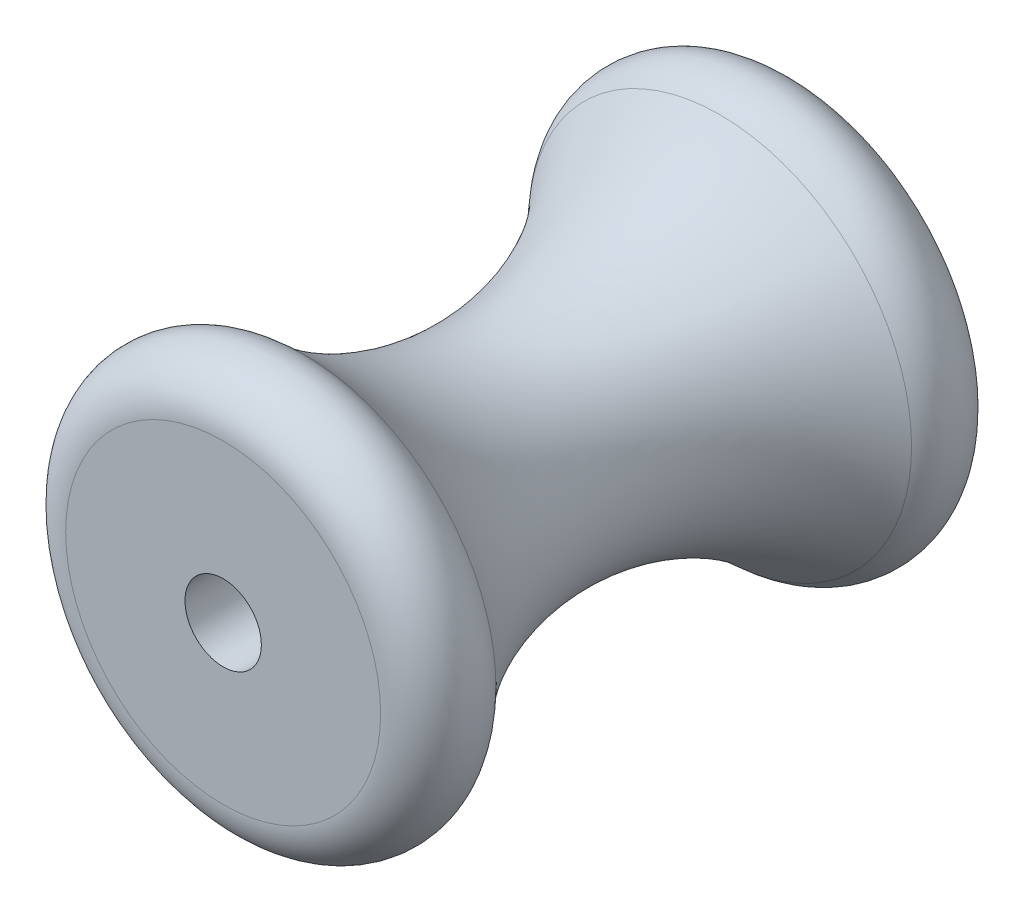
ISO-10303-21;
HEADER;
FILE_DESCRIPTION(('STEP AP214'),'2;1');
FILE_NAME('part.step','',(''),(''),'','','');
FILE_SCHEMA(('AUTOMOTIVE_DESIGN { 1 0 10303 214 1 1 1 1 }'));
ENDSEC;
DATA;
#1=APPLICATION_CONTEXT('core data for automotive mechanical design processes');
#2=APPLICATION_PROTOCOL_DEFINITION('international standard','automotive_design',2000,#1);
#3=PRODUCT_CONTEXT('',#1,'mechanical');
#4=PRODUCT('Part','Part','',(#3));
#5=PRODUCT_RELATED_PRODUCT_CATEGORY('part','',(#4));
#6=PRODUCT_DEFINITION_FORMATION('','',#4);
#7=PRODUCT_DEFINITION_CONTEXT('part definition',#1,'design');
#8=PRODUCT_DEFINITION('design','',#6,#7);
#9=PRODUCT_DEFINITION_SHAPE('','',#8);
#10=(LENGTH_UNIT() NAMED_UNIT(*) SI_UNIT(.MILLI.,.METRE.));
#11=(NAMED_UNIT(*) PLANE_ANGLE_UNIT() SI_UNIT($,.RADIAN.));
#12=(NAMED_UNIT(*) SI_UNIT($,.STERADIAN.) SOLID_ANGLE_UNIT());
#13=UNCERTAINTY_MEASURE_WITH_UNIT(LENGTH_MEASURE(1.E-05),#10,'distance_accuracy_value','');
#14=(GEOMETRIC_REPRESENTATION_CONTEXT(3) GLOBAL_UNCERTAINTY_ASSIGNED_CONTEXT((#13)) GLOBAL_UNIT_ASSIGNED_CONTEXT((#10,
#11,#12)) REPRESENTATION_CONTEXT('',''));
#15=CARTESIAN_POINT('',(0.,0.,0.));
#16=DIRECTION('',(0.,0.,1.));
#17=DIRECTION('',(1.,0.,0.));
#18=AXIS2_PLACEMENT_3D('',#15,#16,#17);
#19=CARTESIAN_POINT('',(0.,0.,-12.1));
#20=DIRECTION('',(0.,0.,-1.));
#21=DIRECTION('',(0.,1.,0.));
#22=AXIS2_PLACEMENT_3D('',#19,#20,#21);
#23=PLANE('',#22);
#24=CARTESIAN_POINT('',(0.,0.,-12.1));
#25=DIRECTION('',(0.,0.,-1.));
#26=DIRECTION('',(0.,1.,0.));
#27=AXIS2_PLACEMENT_3D('',#24,#25,#26);
#28=CIRCLE('',#27,6.59615455708805);
#29=CARTESIAN_POINT('',(0.,6.59615455708805,-12.1));
#30=VERTEX_POINT('',#29);
#31=EDGE_CURVE('E10',#30,#30,#28,.T.);
#32=ORIENTED_EDGE('',*,*,#31,.T.);
#33=EDGE_LOOP('',(#32));
#34=FACE_BOUND('',#33,.T.);
#35=CARTESIAN_POINT('',(0.,0.,-12.1));
#36=DIRECTION('',(0.,0.,-1.));
#37=DIRECTION('',(0.,1.,0.));
#38=AXIS2_PLACEMENT_3D('',#35,#36,#37);
#39=CIRCLE('',#38,1.60000000000001);
#40=CARTESIAN_POINT('',(0.,1.60000000000001,-12.1));
#41=VERTEX_POINT('',#40);
#42=EDGE_CURVE('E64',#41,#41,#39,.T.);
#43=ORIENTED_EDGE('',*,*,#42,.F.);
#44=EDGE_LOOP('',(#43));
#45=FACE_BOUND('',#44,.T.);
#46=ADVANCED_FACE('F41',(#34,#45),#23,.T.);
#47=CARTESIAN_POINT('',(0.,0.,0.));
#48=DIRECTION('',(0.,0.,-1.));
#49=DIRECTION('',(0.,1.,0.));
#50=AXIS2_PLACEMENT_3D('',#47,#48,#49);
#51=TOROIDAL_SURFACE('',#50,17.,12.5);
#52=CARTESIAN_POINT('',(0.,0.,8.70689655172414));
#53=DIRECTION('',(0.,0.,-1.));
#54=DIRECTION('',(0.,1.,0.));
#55=AXIS2_PLACEMENT_3D('',#52,#53,#54);
#56=CIRCLE('',#55,8.03116772162763);
#57=CARTESIAN_POINT('',(0.,8.03116772162763,8.70689655172414));
#58=VERTEX_POINT('',#57);
#59=EDGE_CURVE('E52',#58,#58,#56,.T.);
#60=ORIENTED_EDGE('',*,*,#59,.T.);
#61=EDGE_LOOP('',(#60));
#62=FACE_BOUND('',#61,.T.);
#63=CARTESIAN_POINT('',(0.,0.,-8.70689655172414));
#64=DIRECTION('',(0.,0.,1.));
#65=DIRECTION('',(0.,-1.,0.));
#66=AXIS2_PLACEMENT_3D('',#63,#64,#65);
#67=CIRCLE('',#66,8.03116772162763);
#68=CARTESIAN_POINT('',(0.,-8.03116772162763,-8.70689655172415));
#69=VERTEX_POINT('',#68);
#70=EDGE_CURVE('E56',#69,#69,#67,.T.);
#71=ORIENTED_EDGE('',*,*,#70,.T.);
#72=EDGE_LOOP('',(#71));
#73=FACE_BOUND('',#72,.T.);
#74=ADVANCED_FACE('F71',(#62,#73),#51,.F.);
#75=CARTESIAN_POINT('',(0.,0.,12.1));
#76=DIRECTION('',(0.,0.,-1.));
#77=DIRECTION('',(0.,1.,0.));
#78=AXIS2_PLACEMENT_3D('',#75,#76,#77);
#79=PLANE('',#78);
#80=CARTESIAN_POINT('',(0.,0.,12.1));
#81=DIRECTION('',(0.,0.,-1.));
#82=DIRECTION('',(0.,1.,0.));
#83=AXIS2_PLACEMENT_3D('',#80,#81,#82);
#84=CIRCLE('',#83,6.59615455708805);
#85=CARTESIAN_POINT('',(0.,6.59615455708805,12.1));
#86=VERTEX_POINT('',#85);
#87=EDGE_CURVE('E48',#86,#86,#84,.F.);
#88=ORIENTED_EDGE('',*,*,#87,.T.);
#89=EDGE_LOOP('',(#88));
#90=FACE_BOUND('',#89,.T.);
#91=CARTESIAN_POINT('',(0.,0.,12.1));
#92=DIRECTION('',(0.,0.,-1.));
#93=DIRECTION('',(0.,1.,0.));
#94=AXIS2_PLACEMENT_3D('',#91,#92,#93);
#95=CIRCLE('',#94,1.60000000000001);
#96=CARTESIAN_POINT('',(0.,1.6,12.1));
#97=VERTEX_POINT('',#96);
#98=EDGE_CURVE('E61',#97,#97,#95,.T.);
#99=ORIENTED_EDGE('',*,*,#98,.T.);
#100=EDGE_LOOP('',(#99));
#101=FACE_BOUND('',#100,.T.);
#102=ADVANCED_FACE('F77',(#90,#101),#79,.F.);
#103=CARTESIAN_POINT('',(0.,0.,-12.5));
#104=DIRECTION('',(0.,0.,-1.));
#105=DIRECTION('',(0.,1.,0.));
#106=AXIS2_PLACEMENT_3D('',#103,#104,#105);
#107=CYLINDRICAL_SURFACE('',#106,1.60000000000001);
#108=ORIENTED_EDGE('',*,*,#98,.F.);
#109=EDGE_LOOP('',(#108));
#110=FACE_BOUND('',#109,.T.);
#111=ORIENTED_EDGE('',*,*,#42,.T.);
#112=EDGE_LOOP('',(#111));
#113=FACE_BOUND('',#112,.T.);
#114=ADVANCED_FACE('F68',(#110,#113),#107,.F.);
#115=CARTESIAN_POINT('',(0.,0.,10.1));
#116=DIRECTION('',(0.,0.,1.));
#117=DIRECTION('',(0.,-1.,0.));
#118=AXIS2_PLACEMENT_3D('',#115,#116,#117);
#119=TOROIDAL_SURFACE('',#118,6.59615455708805,2.);
#120=ORIENTED_EDGE('',*,*,#87,.F.);
#121=EDGE_LOOP('',(#120));
#122=FACE_BOUND('',#121,.T.);
#123=ORIENTED_EDGE('',*,*,#59,.F.);
#124=EDGE_LOOP('',(#123));
#125=FACE_BOUND('',#124,.T.);
#126=ADVANCED_FACE('F81',(#122,#125),#119,.T.);
#127=CARTESIAN_POINT('',(0.,0.,-10.1));
#128=DIRECTION('',(0.,0.,1.));
#129=DIRECTION('',(0.,-1.,0.));
#130=AXIS2_PLACEMENT_3D('',#127,#128,#129);
#131=TOROIDAL_SURFACE('',#130,6.59615455708805,2.);
#132=ORIENTED_EDGE('',*,*,#70,.F.);
#133=EDGE_LOOP('',(#132));
#134=FACE_BOUND('',#133,.T.);
#135=ORIENTED_EDGE('',*,*,#31,.F.);
#136=EDGE_LOOP('',(#135));
#137=FACE_BOUND('',#136,.T.);
#138=ADVANCED_FACE('F43',(#134,#137),#131,.T.);
#139=CLOSED_SHELL('',(#46,#74,#102,#114,#126,#138));
#140=MANIFOLD_SOLID_BREP('B2',#139);
#141=ADVANCED_BREP_SHAPE_REPRESENTATION('',(#18,#140),#14);
#142=SHAPE_DEFINITION_REPRESENTATION(#9,#141);
ENDSEC;
END-ISO-10303-21;
